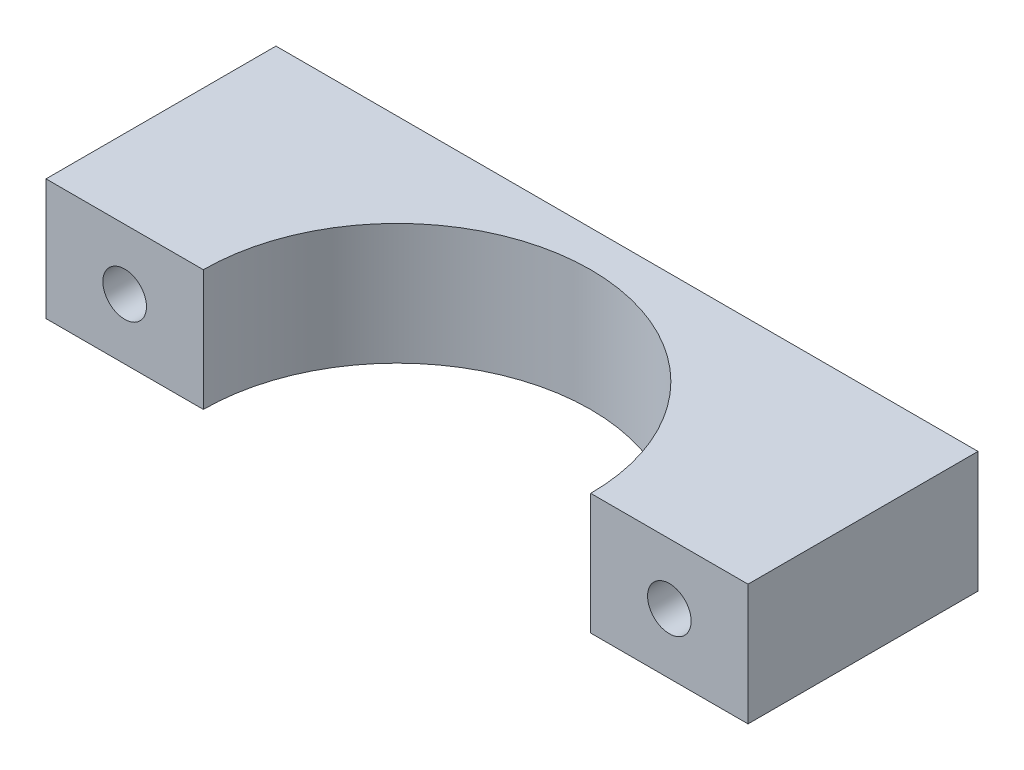
ISO-10303-21;
HEADER;
FILE_DESCRIPTION(('STEP AP214'),'2;1');
FILE_NAME('part.step','',(''),(''),'','','');
FILE_SCHEMA(('AUTOMOTIVE_DESIGN { 1 0 10303 214 1 1 1 1 }'));
ENDSEC;
DATA;
#1=APPLICATION_CONTEXT('core data for automotive mechanical design processes');
#2=APPLICATION_PROTOCOL_DEFINITION('international standard','automotive_design',2000,#1);
#3=PRODUCT_CONTEXT('',#1,'mechanical');
#4=PRODUCT('Part','Part','',(#3));
#5=PRODUCT_RELATED_PRODUCT_CATEGORY('part','',(#4));
#6=PRODUCT_DEFINITION_FORMATION('','',#4);
#7=PRODUCT_DEFINITION_CONTEXT('part definition',#1,'design');
#8=PRODUCT_DEFINITION('design','',#6,#7);
#9=PRODUCT_DEFINITION_SHAPE('','',#8);
#10=(LENGTH_UNIT() NAMED_UNIT(*) SI_UNIT(.MILLI.,.METRE.));
#11=(NAMED_UNIT(*) PLANE_ANGLE_UNIT() SI_UNIT($,.RADIAN.));
#12=(NAMED_UNIT(*) SI_UNIT($,.STERADIAN.) SOLID_ANGLE_UNIT());
#13=UNCERTAINTY_MEASURE_WITH_UNIT(LENGTH_MEASURE(1.E-05),#10,'distance_accuracy_value','');
#14=(GEOMETRIC_REPRESENTATION_CONTEXT(3) GLOBAL_UNCERTAINTY_ASSIGNED_CONTEXT((#13)) GLOBAL_UNIT_ASSIGNED_CONTEXT((#10,
#11,#12)) REPRESENTATION_CONTEXT('',''));
#15=CARTESIAN_POINT('',(0.,0.,0.));
#16=DIRECTION('',(0.,0.,1.));
#17=DIRECTION('',(1.,0.,0.));
#18=AXIS2_PLACEMENT_3D('',#15,#16,#17);
#19=CARTESIAN_POINT('',(-69.3342781396671,10.,-25.5744667064877));
#20=DIRECTION('',(0.,0.,1.));
#21=DIRECTION('',(1.,0.,0.));
#22=AXIS2_PLACEMENT_3D('',#19,#20,#21);
#23=PLANE('',#22);
#24=DIRECTION('',(1.,0.,0.));
#25=VECTOR('',#24,1.);
#26=CARTESIAN_POINT('',(-59.9342781396671,7.9,-25.5744667064877));
#27=LINE('',#26,#25);
#28=CARTESIAN_POINT('',(-65.7342781396671,7.9,-25.5744667064877));
#29=VERTEX_POINT('',#28);
#30=CARTESIAN_POINT('',(-59.9342781396671,7.9,-25.5744667064877));
#31=VERTEX_POINT('',#30);
#32=EDGE_CURVE('E177',#29,#31,#27,.T.);
#33=ORIENTED_EDGE('',*,*,#32,.F.);
#34=DIRECTION('',(0.,1.,0.));
#35=VECTOR('',#34,1.);
#36=CARTESIAN_POINT('',(-65.7342781396671,7.9,-25.5744667064877));
#37=LINE('',#36,#35);
#38=CARTESIAN_POINT('',(-65.7342781396671,2.1,-25.5744667064877));
#39=VERTEX_POINT('',#38);
#40=EDGE_CURVE('E54',#39,#29,#37,.T.);
#41=ORIENTED_EDGE('',*,*,#40,.F.);
#42=DIRECTION('',(-1.,0.,0.));
#43=VECTOR('',#42,1.);
#44=CARTESIAN_POINT('',(-59.9342781396671,2.1,-25.5744667064877));
#45=LINE('',#44,#43);
#46=CARTESIAN_POINT('',(-59.9342781396671,2.1,-25.5744667064877));
#47=VERTEX_POINT('',#46);
#48=EDGE_CURVE('E164',#47,#39,#45,.T.);
#49=ORIENTED_EDGE('',*,*,#48,.F.);
#50=DIRECTION('',(0.,-1.,0.));
#51=VECTOR('',#50,1.);
#52=CARTESIAN_POINT('',(-59.9342781396671,7.9,-25.5744667064877));
#53=LINE('',#52,#51);
#54=EDGE_CURVE('E168',#31,#47,#53,.T.);
#55=ORIENTED_EDGE('',*,*,#54,.F.);
#56=EDGE_LOOP('',(#33,#41,#49,#55));
#57=FACE_BOUND('',#56,.T.);
#58=DIRECTION('',(-1.,0.,0.));
#59=VECTOR('',#58,1.);
#60=CARTESIAN_POINT('',(-20.7342781396671,2.1,-25.5744667064877));
#61=LINE('',#60,#59);
#62=CARTESIAN_POINT('',(-14.9342781396671,2.1,-25.5744667064877));
#63=VERTEX_POINT('',#62);
#64=CARTESIAN_POINT('',(-20.7342781396671,2.1,-25.5744667064877));
#65=VERTEX_POINT('',#64);
#66=EDGE_CURVE('E213',#63,#65,#61,.T.);
#67=ORIENTED_EDGE('',*,*,#66,.F.);
#68=DIRECTION('',(0.,-1.,0.));
#69=VECTOR('',#68,1.);
#70=CARTESIAN_POINT('',(-14.9342781396671,2.1,-25.5744667064877));
#71=LINE('',#70,#69);
#72=CARTESIAN_POINT('',(-14.9342781396671,7.9,-25.5744667064877));
#73=VERTEX_POINT('',#72);
#74=EDGE_CURVE('E62',#73,#63,#71,.T.);
#75=ORIENTED_EDGE('',*,*,#74,.F.);
#76=DIRECTION('',(1.,0.,0.));
#77=VECTOR('',#76,1.);
#78=CARTESIAN_POINT('',(-20.7342781396671,7.9,-25.5744667064877));
#79=LINE('',#78,#77);
#80=CARTESIAN_POINT('',(-20.7342781396671,7.9,-25.5744667064877));
#81=VERTEX_POINT('',#80);
#82=EDGE_CURVE('E198',#81,#73,#79,.T.);
#83=ORIENTED_EDGE('',*,*,#82,.F.);
#84=DIRECTION('',(0.,1.,0.));
#85=VECTOR('',#84,1.);
#86=CARTESIAN_POINT('',(-20.7342781396671,2.1,-25.5744667064877));
#87=LINE('',#86,#85);
#88=EDGE_CURVE('E217',#65,#81,#87,.T.);
#89=ORIENTED_EDGE('',*,*,#88,.F.);
#90=EDGE_LOOP('',(#67,#75,#83,#89));
#91=FACE_BOUND('',#90,.T.);
#92=DIRECTION('',(-1.,0.,0.));
#93=VECTOR('',#92,1.);
#94=CARTESIAN_POINT('',(-69.3342781396671,0.,-25.5744667064877));
#95=LINE('',#94,#93);
#96=CARTESIAN_POINT('',(-11.3342781396671,0.,-25.5744667064877));
#97=VERTEX_POINT('',#96);
#98=CARTESIAN_POINT('',(-69.3342781396671,0.,-25.5744667064877));
#99=VERTEX_POINT('',#98);
#100=EDGE_CURVE('E242',#97,#99,#95,.T.);
#101=ORIENTED_EDGE('',*,*,#100,.T.);
#102=DIRECTION('',(0.,-1.,0.));
#103=VECTOR('',#102,1.);
#104=CARTESIAN_POINT('',(-69.3342781396671,10.,-25.5744667064877));
#105=LINE('',#104,#103);
#106=CARTESIAN_POINT('',(-69.3342781396671,10.,-25.5744667064877));
#107=VERTEX_POINT('',#106);
#108=EDGE_CURVE('E11',#107,#99,#105,.T.);
#109=ORIENTED_EDGE('',*,*,#108,.F.);
#110=DIRECTION('',(-1.,0.,0.));
#111=VECTOR('',#110,1.);
#112=CARTESIAN_POINT('',(-69.3342781396671,10.,-25.5744667064877));
#113=LINE('',#112,#111);
#114=CARTESIAN_POINT('',(-11.3342781396671,10.,-25.5744667064877));
#115=VERTEX_POINT('',#114);
#116=EDGE_CURVE('E250',#115,#107,#113,.T.);
#117=ORIENTED_EDGE('',*,*,#116,.F.);
#118=DIRECTION('',(0.,-1.,0.));
#119=VECTOR('',#118,1.);
#120=CARTESIAN_POINT('',(-11.3342781396671,10.,-25.5744667064877));
#121=LINE('',#120,#119);
#122=EDGE_CURVE('E270',#115,#97,#121,.T.);
#123=ORIENTED_EDGE('',*,*,#122,.T.);
#124=EDGE_LOOP('',(#101,#109,#117,#123));
#125=FACE_BOUND('',#124,.T.);
#126=ADVANCED_FACE('F39',(#57,#91,#125),#23,.F.);
#127=CARTESIAN_POINT('',(-69.3342781396671,10.,-6.57446670648769));
#128=DIRECTION('',(1.,0.,0.));
#129=DIRECTION('',(0.,0.,-1.));
#130=AXIS2_PLACEMENT_3D('',#127,#128,#129);
#131=PLANE('',#130);
#132=DIRECTION('',(0.,0.,1.));
#133=VECTOR('',#132,1.);
#134=CARTESIAN_POINT('',(-69.3342781396671,0.,-6.57446670648769));
#135=LINE('',#134,#133);
#136=CARTESIAN_POINT('',(-69.3342781396671,0.,-6.57446670648769));
#137=VERTEX_POINT('',#136);
#138=EDGE_CURVE('E274',#99,#137,#135,.T.);
#139=ORIENTED_EDGE('',*,*,#138,.T.);
#140=DIRECTION('',(0.,-1.,0.));
#141=VECTOR('',#140,1.);
#142=CARTESIAN_POINT('',(-69.3342781396671,10.,-6.57446670648769));
#143=LINE('',#142,#141);
#144=CARTESIAN_POINT('',(-69.3342781396671,10.,-6.57446670648769));
#145=VERTEX_POINT('',#144);
#146=EDGE_CURVE('E47',#145,#137,#143,.T.);
#147=ORIENTED_EDGE('',*,*,#146,.F.);
#148=DIRECTION('',(0.,0.,1.));
#149=VECTOR('',#148,1.);
#150=CARTESIAN_POINT('',(-69.3342781396671,10.,-6.57446670648769));
#151=LINE('',#150,#149);
#152=EDGE_CURVE('E254',#107,#145,#151,.T.);
#153=ORIENTED_EDGE('',*,*,#152,.F.);
#154=ORIENTED_EDGE('',*,*,#108,.T.);
#155=EDGE_LOOP('',(#139,#147,#153,#154));
#156=FACE_BOUND('',#155,.T.);
#157=ADVANCED_FACE('F331',(#156),#131,.F.);
#158=CARTESIAN_POINT('',(-69.3342781396671,10.,-6.57446670648769));
#159=DIRECTION('',(0.,0.,-1.));
#160=DIRECTION('',(-1.,0.,0.));
#161=AXIS2_PLACEMENT_3D('',#158,#159,#160);
#162=PLANE('',#161);
#163=CARTESIAN_POINT('',(-62.8342781396671,5.,-6.57446670648769));
#164=DIRECTION('',(0.,0.,1.));
#165=DIRECTION('',(1.,0.,0.));
#166=AXIS2_PLACEMENT_3D('',#163,#164,#165);
#167=CIRCLE('',#166,1.8);
#168=CARTESIAN_POINT('',(-61.0342781396671,5.,-6.57446670648769));
#169=VERTEX_POINT('',#168);
#170=EDGE_CURVE('E238',#169,#169,#167,.T.);
#171=ORIENTED_EDGE('',*,*,#170,.F.);
#172=EDGE_LOOP('',(#171));
#173=FACE_BOUND('',#172,.T.);
#174=DIRECTION('',(1.,0.,0.));
#175=VECTOR('',#174,1.);
#176=CARTESIAN_POINT('',(-69.3342781396671,0.,-6.57446670648769));
#177=LINE('',#176,#175);
#178=CARTESIAN_POINT('',(-56.3342781396671,0.,-6.57446670648769));
#179=VERTEX_POINT('',#178);
#180=EDGE_CURVE('E277',#137,#179,#177,.T.);
#181=ORIENTED_EDGE('',*,*,#180,.T.);
#182=DIRECTION('',(0.,-1.,0.));
#183=VECTOR('',#182,1.);
#184=CARTESIAN_POINT('',(-56.3342781396671,10.,-6.57446670648769));
#185=LINE('',#184,#183);
#186=CARTESIAN_POINT('',(-56.3342781396671,10.,-6.57446670648769));
#187=VERTEX_POINT('',#186);
#188=EDGE_CURVE('E299',#187,#179,#185,.T.);
#189=ORIENTED_EDGE('',*,*,#188,.F.);
#190=DIRECTION('',(1.,0.,0.));
#191=VECTOR('',#190,1.);
#192=CARTESIAN_POINT('',(-69.3342781396671,10.,-6.57446670648769));
#193=LINE('',#192,#191);
#194=EDGE_CURVE('E258',#145,#187,#193,.T.);
#195=ORIENTED_EDGE('',*,*,#194,.F.);
#196=ORIENTED_EDGE('',*,*,#146,.T.);
#197=EDGE_LOOP('',(#181,#189,#195,#196));
#198=FACE_BOUND('',#197,.T.);
#199=ADVANCED_FACE('F308',(#173,#198),#162,.F.);
#200=CARTESIAN_POINT('',(-40.3342781396671,10.,-6.57446670648769));
#201=DIRECTION('',(0.,-1.,0.));
#202=DIRECTION('',(0.,0.,-1.));
#203=AXIS2_PLACEMENT_3D('',#200,#201,#202);
#204=CYLINDRICAL_SURFACE('',#203,16.);
#205=CARTESIAN_POINT('',(-40.3342781396671,0.,-6.57446670648769));
#206=DIRECTION('',(0.,-1.,0.));
#207=DIRECTION('',(0.,0.,-1.));
#208=AXIS2_PLACEMENT_3D('',#205,#206,#207);
#209=CIRCLE('',#208,16.);
#210=CARTESIAN_POINT('',(-24.3342781396671,0.,-6.57446670648769));
#211=VERTEX_POINT('',#210);
#212=EDGE_CURVE('E280',#179,#211,#209,.T.);
#213=ORIENTED_EDGE('',*,*,#212,.T.);
#214=DIRECTION('',(0.,-1.,0.));
#215=VECTOR('',#214,1.);
#216=CARTESIAN_POINT('',(-24.3342781396671,10.,-6.57446670648769));
#217=LINE('',#216,#215);
#218=CARTESIAN_POINT('',(-24.3342781396671,10.,-6.57446670648769));
#219=VERTEX_POINT('',#218);
#220=EDGE_CURVE('E295',#219,#211,#217,.T.);
#221=ORIENTED_EDGE('',*,*,#220,.F.);
#222=CARTESIAN_POINT('',(-40.3342781396671,10.,-6.57446670648769));
#223=DIRECTION('',(0.,-1.,0.));
#224=DIRECTION('',(0.,0.,-1.));
#225=AXIS2_PLACEMENT_3D('',#222,#223,#224);
#226=CIRCLE('',#225,16.);
#227=EDGE_CURVE('E261',#187,#219,#226,.T.);
#228=ORIENTED_EDGE('',*,*,#227,.F.);
#229=ORIENTED_EDGE('',*,*,#188,.T.);
#230=EDGE_LOOP('',(#213,#221,#228,#229));
#231=FACE_BOUND('',#230,.T.);
#232=ADVANCED_FACE('F319',(#231),#204,.F.);
#233=CARTESIAN_POINT('',(-11.3342781396671,10.,-6.57446670648769));
#234=DIRECTION('',(0.,0.,-1.));
#235=DIRECTION('',(-1.,0.,0.));
#236=AXIS2_PLACEMENT_3D('',#233,#234,#235);
#237=PLANE('',#236);
#238=CARTESIAN_POINT('',(-17.8342781396671,5.,-6.57446670648769));
#239=DIRECTION('',(0.,0.,1.));
#240=DIRECTION('',(1.,0.,0.));
#241=AXIS2_PLACEMENT_3D('',#238,#239,#240);
#242=CIRCLE('',#241,1.8);
#243=CARTESIAN_POINT('',(-16.0342781396671,5.,-6.57446670648769));
#244=VERTEX_POINT('',#243);
#245=EDGE_CURVE('E243',#244,#244,#242,.T.);
#246=ORIENTED_EDGE('',*,*,#245,.F.);
#247=EDGE_LOOP('',(#246));
#248=FACE_BOUND('',#247,.T.);
#249=DIRECTION('',(1.,0.,0.));
#250=VECTOR('',#249,1.);
#251=CARTESIAN_POINT('',(-11.3342781396671,0.,-6.57446670648769));
#252=LINE('',#251,#250);
#253=CARTESIAN_POINT('',(-11.3342781396671,0.,-6.57446670648769));
#254=VERTEX_POINT('',#253);
#255=EDGE_CURVE('E283',#211,#254,#252,.T.);
#256=ORIENTED_EDGE('',*,*,#255,.T.);
#257=DIRECTION('',(0.,-1.,0.));
#258=VECTOR('',#257,1.);
#259=CARTESIAN_POINT('',(-11.3342781396671,10.,-6.57446670648769));
#260=LINE('',#259,#258);
#261=CARTESIAN_POINT('',(-11.3342781396671,10.,-6.57446670648769));
#262=VERTEX_POINT('',#261);
#263=EDGE_CURVE('E291',#262,#254,#260,.T.);
#264=ORIENTED_EDGE('',*,*,#263,.F.);
#265=DIRECTION('',(1.,0.,0.));
#266=VECTOR('',#265,1.);
#267=CARTESIAN_POINT('',(-11.3342781396671,10.,-6.57446670648769));
#268=LINE('',#267,#266);
#269=EDGE_CURVE('E264',#219,#262,#268,.T.);
#270=ORIENTED_EDGE('',*,*,#269,.F.);
#271=ORIENTED_EDGE('',*,*,#220,.T.);
#272=EDGE_LOOP('',(#256,#264,#270,#271));
#273=FACE_BOUND('',#272,.T.);
#274=ADVANCED_FACE('F323',(#248,#273),#237,.F.);
#275=CARTESIAN_POINT('',(-11.3342781396671,10.,-25.5744667064877));
#276=DIRECTION('',(-1.,0.,0.));
#277=DIRECTION('',(0.,0.,1.));
#278=AXIS2_PLACEMENT_3D('',#275,#276,#277);
#279=PLANE('',#278);
#280=DIRECTION('',(0.,0.,-1.));
#281=VECTOR('',#280,1.);
#282=CARTESIAN_POINT('',(-11.3342781396671,0.,-25.5744667064877));
#283=LINE('',#282,#281);
#284=EDGE_CURVE('E255',#254,#97,#283,.T.);
#285=ORIENTED_EDGE('',*,*,#284,.T.);
#286=ORIENTED_EDGE('',*,*,#122,.F.);
#287=DIRECTION('',(0.,0.,-1.));
#288=VECTOR('',#287,1.);
#289=CARTESIAN_POINT('',(-11.3342781396671,10.,-25.5744667064877));
#290=LINE('',#289,#288);
#291=EDGE_CURVE('E267',#262,#115,#290,.T.);
#292=ORIENTED_EDGE('',*,*,#291,.F.);
#293=ORIENTED_EDGE('',*,*,#263,.T.);
#294=EDGE_LOOP('',(#285,#286,#292,#293));
#295=FACE_BOUND('',#294,.T.);
#296=ADVANCED_FACE('F334',(#295),#279,.F.);
#297=CARTESIAN_POINT('',(-40.3342781396671,10.,-6.57446670648769));
#298=DIRECTION('',(0.,-1.,0.));
#299=DIRECTION('',(0.,0.,-1.));
#300=AXIS2_PLACEMENT_3D('',#297,#298,#299);
#301=PLANE('',#300);
#302=ORIENTED_EDGE('',*,*,#116,.T.);
#303=ORIENTED_EDGE('',*,*,#152,.T.);
#304=ORIENTED_EDGE('',*,*,#194,.T.);
#305=ORIENTED_EDGE('',*,*,#227,.T.);
#306=ORIENTED_EDGE('',*,*,#269,.T.);
#307=ORIENTED_EDGE('',*,*,#291,.T.);
#308=EDGE_LOOP('',(#302,#303,#304,#305,#306,#307));
#309=FACE_BOUND('',#308,.T.);
#310=ADVANCED_FACE('F327',(#309),#301,.F.);
#311=CARTESIAN_POINT('',(-40.3342781396671,0.,-6.57446670648769));
#312=DIRECTION('',(0.,-1.,0.));
#313=DIRECTION('',(0.,0.,-1.));
#314=AXIS2_PLACEMENT_3D('',#311,#312,#313);
#315=PLANE('',#314);
#316=ORIENTED_EDGE('',*,*,#100,.F.);
#317=ORIENTED_EDGE('',*,*,#284,.F.);
#318=ORIENTED_EDGE('',*,*,#255,.F.);
#319=ORIENTED_EDGE('',*,*,#212,.F.);
#320=ORIENTED_EDGE('',*,*,#180,.F.);
#321=ORIENTED_EDGE('',*,*,#138,.F.);
#322=EDGE_LOOP('',(#316,#317,#318,#319,#320,#321));
#323=FACE_BOUND('',#322,.T.);
#324=ADVANCED_FACE('F314',(#323),#315,.T.);
#325=CARTESIAN_POINT('',(-17.8342781396671,5.,-11.5744667064877));
#326=DIRECTION('',(0.,0.,1.));
#327=DIRECTION('',(1.,0.,0.));
#328=AXIS2_PLACEMENT_3D('',#325,#326,#327);
#329=CYLINDRICAL_SURFACE('',#328,1.8);
#330=CARTESIAN_POINT('',(-17.8342781396671,5.,-11.5744667064877));
#331=DIRECTION('',(0.,0.,1.));
#332=DIRECTION('',(1.,0.,0.));
#333=AXIS2_PLACEMENT_3D('',#330,#331,#332);
#334=CIRCLE('',#333,1.8);
#335=CARTESIAN_POINT('',(-16.0342781396671,5.,-11.5744667064877));
#336=VERTEX_POINT('',#335);
#337=EDGE_CURVE('E237',#336,#336,#334,.T.);
#338=ORIENTED_EDGE('',*,*,#337,.F.);
#339=EDGE_LOOP('',(#338));
#340=FACE_BOUND('',#339,.T.);
#341=ORIENTED_EDGE('',*,*,#245,.T.);
#342=EDGE_LOOP('',(#341));
#343=FACE_BOUND('',#342,.T.);
#344=ADVANCED_FACE('F384',(#340,#343),#329,.F.);
#345=CARTESIAN_POINT('',(-62.8342781396671,5.,-11.5744667064877));
#346=DIRECTION('',(0.,0.,1.));
#347=DIRECTION('',(1.,0.,0.));
#348=AXIS2_PLACEMENT_3D('',#345,#346,#347);
#349=CYLINDRICAL_SURFACE('',#348,1.8);
#350=CARTESIAN_POINT('',(-62.8342781396671,5.,-11.5744667064877));
#351=DIRECTION('',(0.,0.,1.));
#352=DIRECTION('',(1.,0.,0.));
#353=AXIS2_PLACEMENT_3D('',#350,#351,#352);
#354=CIRCLE('',#353,1.8);
#355=CARTESIAN_POINT('',(-61.0342781396671,5.,-11.5744667064877));
#356=VERTEX_POINT('',#355);
#357=EDGE_CURVE('E187',#356,#356,#354,.T.);
#358=ORIENTED_EDGE('',*,*,#357,.F.);
#359=EDGE_LOOP('',(#358));
#360=FACE_BOUND('',#359,.T.);
#361=ORIENTED_EDGE('',*,*,#170,.T.);
#362=EDGE_LOOP('',(#361));
#363=FACE_BOUND('',#362,.T.);
#364=ADVANCED_FACE('F381',(#360,#363),#349,.F.);
#365=CARTESIAN_POINT('',(0.,0.,-11.5744667064877));
#366=DIRECTION('',(0.,0.,-1.));
#367=DIRECTION('',(-1.,0.,0.));
#368=AXIS2_PLACEMENT_3D('',#365,#366,#367);
#369=PLANE('',#368);
#370=DIRECTION('',(0.,-1.,0.));
#371=VECTOR('',#370,1.);
#372=CARTESIAN_POINT('',(-14.9342781396671,2.1,-11.5744667064877));
#373=LINE('',#372,#371);
#374=CARTESIAN_POINT('',(-14.9342781396671,7.9,-11.5744667064877));
#375=VERTEX_POINT('',#374);
#376=CARTESIAN_POINT('',(-14.9342781396671,2.1,-11.5744667064877));
#377=VERTEX_POINT('',#376);
#378=EDGE_CURVE('E193',#375,#377,#373,.T.);
#379=ORIENTED_EDGE('',*,*,#378,.T.);
#380=DIRECTION('',(-1.,0.,0.));
#381=VECTOR('',#380,1.);
#382=CARTESIAN_POINT('',(-20.7342781396671,2.1,-11.5744667064877));
#383=LINE('',#382,#381);
#384=CARTESIAN_POINT('',(-20.7342781396671,2.1,-11.5744667064877));
#385=VERTEX_POINT('',#384);
#386=EDGE_CURVE('E197',#377,#385,#383,.T.);
#387=ORIENTED_EDGE('',*,*,#386,.T.);
#388=DIRECTION('',(0.,1.,0.));
#389=VECTOR('',#388,1.);
#390=CARTESIAN_POINT('',(-20.7342781396671,2.1,-11.5744667064877));
#391=LINE('',#390,#389);
#392=CARTESIAN_POINT('',(-20.7342781396671,7.9,-11.5744667064877));
#393=VERTEX_POINT('',#392);
#394=EDGE_CURVE('E202',#385,#393,#391,.T.);
#395=ORIENTED_EDGE('',*,*,#394,.T.);
#396=DIRECTION('',(1.,0.,0.));
#397=VECTOR('',#396,1.);
#398=CARTESIAN_POINT('',(-20.7342781396671,7.9,-11.5744667064877));
#399=LINE('',#398,#397);
#400=EDGE_CURVE('E206',#393,#375,#399,.T.);
#401=ORIENTED_EDGE('',*,*,#400,.T.);
#402=EDGE_LOOP('',(#379,#387,#395,#401));
#403=FACE_BOUND('',#402,.T.);
#404=ORIENTED_EDGE('',*,*,#337,.T.);
#405=EDGE_LOOP('',(#404));
#406=FACE_BOUND('',#405,.T.);
#407=ADVANCED_FACE('F363',(#403,#406),#369,.T.);
#408=CARTESIAN_POINT('',(-14.9342781396671,2.1,-11.5744667064877));
#409=DIRECTION('',(1.,0.,0.));
#410=DIRECTION('',(0.,0.,-1.));
#411=AXIS2_PLACEMENT_3D('',#408,#409,#410);
#412=PLANE('',#411);
#413=ORIENTED_EDGE('',*,*,#74,.T.);
#414=DIRECTION('',(0.,0.,-1.));
#415=VECTOR('',#414,1.);
#416=CARTESIAN_POINT('',(-14.9342781396671,2.1,-11.5744667064877));
#417=LINE('',#416,#415);
#418=EDGE_CURVE('E210',#377,#63,#417,.T.);
#419=ORIENTED_EDGE('',*,*,#418,.F.);
#420=ORIENTED_EDGE('',*,*,#378,.F.);
#421=DIRECTION('',(0.,0.,-1.));
#422=VECTOR('',#421,1.);
#423=CARTESIAN_POINT('',(-14.9342781396671,7.9,-11.5744667064877));
#424=LINE('',#423,#422);
#425=EDGE_CURVE('E178',#375,#73,#424,.T.);
#426=ORIENTED_EDGE('',*,*,#425,.T.);
#427=EDGE_LOOP('',(#413,#419,#420,#426));
#428=FACE_BOUND('',#427,.T.);
#429=ADVANCED_FACE('F360',(#428),#412,.F.);
#430=CARTESIAN_POINT('',(-20.7342781396671,7.9,-11.5744667064877));
#431=DIRECTION('',(0.,1.,0.));
#432=DIRECTION('',(0.,0.,1.));
#433=AXIS2_PLACEMENT_3D('',#430,#431,#432);
#434=PLANE('',#433);
#435=ORIENTED_EDGE('',*,*,#82,.T.);
#436=ORIENTED_EDGE('',*,*,#425,.F.);
#437=ORIENTED_EDGE('',*,*,#400,.F.);
#438=DIRECTION('',(0.,0.,-1.));
#439=VECTOR('',#438,1.);
#440=CARTESIAN_POINT('',(-20.7342781396671,7.9,-11.5744667064877));
#441=LINE('',#440,#439);
#442=EDGE_CURVE('E226',#393,#81,#441,.T.);
#443=ORIENTED_EDGE('',*,*,#442,.T.);
#444=EDGE_LOOP('',(#435,#436,#437,#443));
#445=FACE_BOUND('',#444,.T.);
#446=ADVANCED_FACE('F366',(#445),#434,.F.);
#447=CARTESIAN_POINT('',(-20.7342781396671,2.1,-11.5744667064877));
#448=DIRECTION('',(-1.,0.,0.));
#449=DIRECTION('',(0.,0.,1.));
#450=AXIS2_PLACEMENT_3D('',#447,#448,#449);
#451=PLANE('',#450);
#452=ORIENTED_EDGE('',*,*,#88,.T.);
#453=ORIENTED_EDGE('',*,*,#442,.F.);
#454=ORIENTED_EDGE('',*,*,#394,.F.);
#455=DIRECTION('',(0.,0.,-1.));
#456=VECTOR('',#455,1.);
#457=CARTESIAN_POINT('',(-20.7342781396671,2.1,-11.5744667064877));
#458=LINE('',#457,#456);
#459=EDGE_CURVE('E229',#385,#65,#458,.T.);
#460=ORIENTED_EDGE('',*,*,#459,.T.);
#461=EDGE_LOOP('',(#452,#453,#454,#460));
#462=FACE_BOUND('',#461,.T.);
#463=ADVANCED_FACE('F368',(#462),#451,.F.);
#464=CARTESIAN_POINT('',(-20.7342781396671,2.1,-11.5744667064877));
#465=DIRECTION('',(0.,-1.,0.));
#466=DIRECTION('',(1.,0.,0.));
#467=AXIS2_PLACEMENT_3D('',#464,#465,#466);
#468=PLANE('',#467);
#469=ORIENTED_EDGE('',*,*,#66,.T.);
#470=ORIENTED_EDGE('',*,*,#459,.F.);
#471=ORIENTED_EDGE('',*,*,#386,.F.);
#472=ORIENTED_EDGE('',*,*,#418,.T.);
#473=EDGE_LOOP('',(#469,#470,#471,#472));
#474=FACE_BOUND('',#473,.T.);
#475=ADVANCED_FACE('F356',(#474),#468,.F.);
#476=CARTESIAN_POINT('',(0.,0.,-11.5744667064877));
#477=DIRECTION('',(0.,0.,-1.));
#478=DIRECTION('',(-1.,0.,0.));
#479=AXIS2_PLACEMENT_3D('',#476,#477,#478);
#480=PLANE('',#479);
#481=DIRECTION('',(0.,1.,0.));
#482=VECTOR('',#481,1.);
#483=CARTESIAN_POINT('',(-65.7342781396671,7.9,-11.5744667064877));
#484=LINE('',#483,#482);
#485=CARTESIAN_POINT('',(-65.7342781396671,2.1,-11.5744667064877));
#486=VERTEX_POINT('',#485);
#487=CARTESIAN_POINT('',(-65.7342781396671,7.9,-11.5744667064877));
#488=VERTEX_POINT('',#487);
#489=EDGE_CURVE('E142',#486,#488,#484,.T.);
#490=ORIENTED_EDGE('',*,*,#489,.T.);
#491=DIRECTION('',(1.,0.,0.));
#492=VECTOR('',#491,1.);
#493=CARTESIAN_POINT('',(-59.9342781396671,7.9,-11.5744667064877));
#494=LINE('',#493,#492);
#495=CARTESIAN_POINT('',(-59.9342781396671,7.9,-11.5744667064877));
#496=VERTEX_POINT('',#495);
#497=EDGE_CURVE('E152',#488,#496,#494,.T.);
#498=ORIENTED_EDGE('',*,*,#497,.T.);
#499=DIRECTION('',(0.,-1.,0.));
#500=VECTOR('',#499,1.);
#501=CARTESIAN_POINT('',(-59.9342781396671,7.9,-11.5744667064877));
#502=LINE('',#501,#500);
#503=CARTESIAN_POINT('',(-59.9342781396671,2.1,-11.5744667064877));
#504=VERTEX_POINT('',#503);
#505=EDGE_CURVE('E158',#496,#504,#502,.T.);
#506=ORIENTED_EDGE('',*,*,#505,.T.);
#507=DIRECTION('',(-1.,0.,0.));
#508=VECTOR('',#507,1.);
#509=CARTESIAN_POINT('',(-59.9342781396671,2.1,-11.5744667064877));
#510=LINE('',#509,#508);
#511=EDGE_CURVE('E149',#504,#486,#510,.T.);
#512=ORIENTED_EDGE('',*,*,#511,.T.);
#513=EDGE_LOOP('',(#490,#498,#506,#512));
#514=FACE_BOUND('',#513,.T.);
#515=ORIENTED_EDGE('',*,*,#357,.T.);
#516=EDGE_LOOP('',(#515));
#517=FACE_BOUND('',#516,.T.);
#518=ADVANCED_FACE('F160',(#514,#517),#480,.T.);
#519=CARTESIAN_POINT('',(-65.7342781396671,7.9,-11.5744667064877));
#520=DIRECTION('',(-1.,0.,0.));
#521=DIRECTION('',(0.,0.,1.));
#522=AXIS2_PLACEMENT_3D('',#519,#520,#521);
#523=PLANE('',#522);
#524=ORIENTED_EDGE('',*,*,#40,.T.);
#525=DIRECTION('',(0.,0.,-1.));
#526=VECTOR('',#525,1.);
#527=CARTESIAN_POINT('',(-65.7342781396671,7.9,-11.5744667064877));
#528=LINE('',#527,#526);
#529=EDGE_CURVE('E138',#488,#29,#528,.T.);
#530=ORIENTED_EDGE('',*,*,#529,.F.);
#531=ORIENTED_EDGE('',*,*,#489,.F.);
#532=DIRECTION('',(0.,0.,-1.));
#533=VECTOR('',#532,1.);
#534=CARTESIAN_POINT('',(-65.7342781396671,2.1,-11.5744667064877));
#535=LINE('',#534,#533);
#536=EDGE_CURVE('E184',#486,#39,#535,.T.);
#537=ORIENTED_EDGE('',*,*,#536,.T.);
#538=EDGE_LOOP('',(#524,#530,#531,#537));
#539=FACE_BOUND('',#538,.T.);
#540=ADVANCED_FACE('F140',(#539),#523,.F.);
#541=CARTESIAN_POINT('',(-59.9342781396671,2.1,-11.5744667064877));
#542=DIRECTION('',(0.,-1.,0.));
#543=DIRECTION('',(0.,0.,-1.));
#544=AXIS2_PLACEMENT_3D('',#541,#542,#543);
#545=PLANE('',#544);
#546=ORIENTED_EDGE('',*,*,#48,.T.);
#547=ORIENTED_EDGE('',*,*,#536,.F.);
#548=ORIENTED_EDGE('',*,*,#511,.F.);
#549=DIRECTION('',(0.,0.,-1.));
#550=VECTOR('',#549,1.);
#551=CARTESIAN_POINT('',(-59.9342781396671,2.1,-11.5744667064877));
#552=LINE('',#551,#550);
#553=EDGE_CURVE('E188',#504,#47,#552,.T.);
#554=ORIENTED_EDGE('',*,*,#553,.T.);
#555=EDGE_LOOP('',(#546,#547,#548,#554));
#556=FACE_BOUND('',#555,.T.);
#557=ADVANCED_FACE('F443',(#556),#545,.F.);
#558=CARTESIAN_POINT('',(-59.9342781396671,7.9,-11.5744667064877));
#559=DIRECTION('',(1.,0.,0.));
#560=DIRECTION('',(0.,0.,-1.));
#561=AXIS2_PLACEMENT_3D('',#558,#559,#560);
#562=PLANE('',#561);
#563=ORIENTED_EDGE('',*,*,#54,.T.);
#564=ORIENTED_EDGE('',*,*,#553,.F.);
#565=ORIENTED_EDGE('',*,*,#505,.F.);
#566=DIRECTION('',(0.,0.,-1.));
#567=VECTOR('',#566,1.);
#568=CARTESIAN_POINT('',(-59.9342781396671,7.9,-11.5744667064877));
#569=LINE('',#568,#567);
#570=EDGE_CURVE('E148',#496,#31,#569,.T.);
#571=ORIENTED_EDGE('',*,*,#570,.T.);
#572=EDGE_LOOP('',(#563,#564,#565,#571));
#573=FACE_BOUND('',#572,.T.);
#574=ADVANCED_FACE('F452',(#573),#562,.F.);
#575=CARTESIAN_POINT('',(-59.9342781396671,7.9,-11.5744667064877));
#576=DIRECTION('',(0.,1.,0.));
#577=DIRECTION('',(0.,0.,1.));
#578=AXIS2_PLACEMENT_3D('',#575,#576,#577);
#579=PLANE('',#578);
#580=ORIENTED_EDGE('',*,*,#32,.T.);
#581=ORIENTED_EDGE('',*,*,#570,.F.);
#582=ORIENTED_EDGE('',*,*,#497,.F.);
#583=ORIENTED_EDGE('',*,*,#529,.T.);
#584=EDGE_LOOP('',(#580,#581,#582,#583));
#585=FACE_BOUND('',#584,.T.);
#586=ADVANCED_FACE('F153',(#585),#579,.F.);
#587=CLOSED_SHELL('',(#126,#157,#199,#232,#274,#296,#310,#324,#344,#364,#407,#429,#446,#463,
#475,#518,#540,#557,#574,#586));
#588=MANIFOLD_SOLID_BREP('B2',#587);
#589=ADVANCED_BREP_SHAPE_REPRESENTATION('',(#18,#588),#14);
#590=SHAPE_DEFINITION_REPRESENTATION(#9,#589);
ENDSEC;
END-ISO-10303-21;
